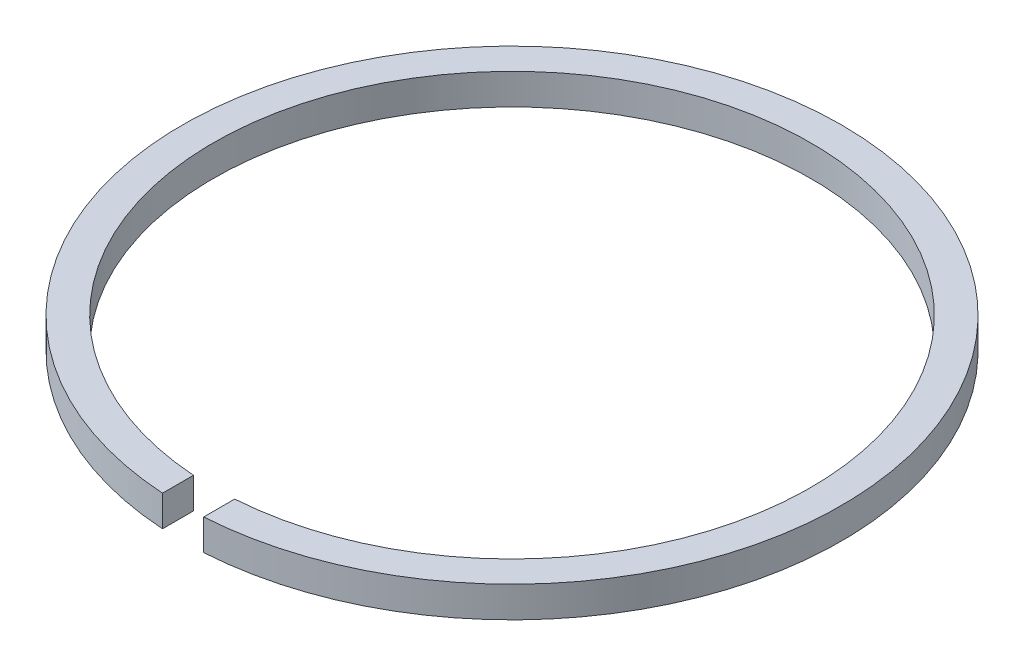
ISO-10303-21;
HEADER;
FILE_DESCRIPTION(('STEP AP214'),'2;1');
FILE_NAME('part.step','',(''),(''),'','','');
FILE_SCHEMA(('AUTOMOTIVE_DESIGN { 1 0 10303 214 1 1 1 1 }'));
ENDSEC;
DATA;
#1=APPLICATION_CONTEXT('core data for automotive mechanical design processes');
#2=APPLICATION_PROTOCOL_DEFINITION('international standard','automotive_design',2000,#1);
#3=PRODUCT_CONTEXT('',#1,'mechanical');
#4=PRODUCT('Part','Part','',(#3));
#5=PRODUCT_RELATED_PRODUCT_CATEGORY('part','',(#4));
#6=PRODUCT_DEFINITION_FORMATION('','',#4);
#7=PRODUCT_DEFINITION_CONTEXT('part definition',#1,'design');
#8=PRODUCT_DEFINITION('design','',#6,#7);
#9=PRODUCT_DEFINITION_SHAPE('','',#8);
#10=(LENGTH_UNIT() NAMED_UNIT(*) SI_UNIT(.MILLI.,.METRE.));
#11=(NAMED_UNIT(*) PLANE_ANGLE_UNIT() SI_UNIT($,.RADIAN.));
#12=(NAMED_UNIT(*) SI_UNIT($,.STERADIAN.) SOLID_ANGLE_UNIT());
#13=UNCERTAINTY_MEASURE_WITH_UNIT(LENGTH_MEASURE(1.E-05),#10,'distance_accuracy_value','');
#14=(GEOMETRIC_REPRESENTATION_CONTEXT(3) GLOBAL_UNCERTAINTY_ASSIGNED_CONTEXT((#13)) GLOBAL_UNIT_ASSIGNED_CONTEXT((#10,
#11,#12)) REPRESENTATION_CONTEXT('',''));
#15=CARTESIAN_POINT('',(0.,0.,0.));
#16=DIRECTION('',(0.,0.,1.));
#17=DIRECTION('',(1.,0.,0.));
#18=AXIS2_PLACEMENT_3D('',#15,#16,#17);
#19=CARTESIAN_POINT('',(0.,0.75,0.));
#20=DIRECTION('',(0.,-1.,0.));
#21=DIRECTION('',(0.,0.,-1.));
#22=AXIS2_PLACEMENT_3D('',#19,#20,#21);
#23=CYLINDRICAL_SURFACE('',#22,14.5);
#24=CARTESIAN_POINT('',(0.,-0.75,0.));
#25=DIRECTION('',(0.,1.,0.));
#26=DIRECTION('',(0.,0.,1.));
#27=AXIS2_PLACEMENT_3D('',#24,#25,#26);
#28=CIRCLE('',#27,14.5);
#29=CARTESIAN_POINT('',(1.,-0.75,14.4654761414894));
#30=VERTEX_POINT('',#29);
#31=CARTESIAN_POINT('',(-0.999999999999998,-0.75,14.4654761414894));
#32=VERTEX_POINT('',#31);
#33=EDGE_CURVE('E100',#30,#32,#28,.T.);
#34=ORIENTED_EDGE('',*,*,#33,.F.);
#35=DIRECTION('',(0.,-1.,0.));
#36=VECTOR('',#35,1.);
#37=CARTESIAN_POINT('',(1.,0.75,14.4654761414894));
#38=LINE('',#37,#36);
#39=CARTESIAN_POINT('',(1.,0.75,14.4654761414894));
#40=VERTEX_POINT('',#39);
#41=EDGE_CURVE('E11',#40,#30,#38,.T.);
#42=ORIENTED_EDGE('',*,*,#41,.F.);
#43=CARTESIAN_POINT('',(0.,0.75,0.));
#44=DIRECTION('',(0.,1.,0.));
#45=DIRECTION('',(0.,0.,1.));
#46=AXIS2_PLACEMENT_3D('',#43,#44,#45);
#47=CIRCLE('',#46,14.5);
#48=CARTESIAN_POINT('',(-0.999999999999998,0.75,14.4654761414894));
#49=VERTEX_POINT('',#48);
#50=EDGE_CURVE('E85',#40,#49,#47,.T.);
#51=ORIENTED_EDGE('',*,*,#50,.T.);
#52=DIRECTION('',(0.,-1.,0.));
#53=VECTOR('',#52,1.);
#54=CARTESIAN_POINT('',(-0.999999999999998,0.75,14.4654761414894));
#55=LINE('',#54,#53);
#56=EDGE_CURVE('E53',#49,#32,#55,.T.);
#57=ORIENTED_EDGE('',*,*,#56,.T.);
#58=EDGE_LOOP('',(#34,#42,#51,#57));
#59=FACE_BOUND('',#58,.T.);
#60=ADVANCED_FACE('F37',(#59),#23,.F.);
#61=CARTESIAN_POINT('',(1.,0.75,0.));
#62=DIRECTION('',(1.,0.,0.));
#63=DIRECTION('',(0.,0.,-1.));
#64=AXIS2_PLACEMENT_3D('',#61,#62,#63);
#65=PLANE('',#64);
#66=DIRECTION('',(0.,0.,1.));
#67=VECTOR('',#66,1.);
#68=CARTESIAN_POINT('',(1.,-0.75,0.));
#69=LINE('',#68,#67);
#70=CARTESIAN_POINT('',(1.,-0.75,15.9687194226713));
#71=VERTEX_POINT('',#70);
#72=EDGE_CURVE('E91',#30,#71,#69,.T.);
#73=ORIENTED_EDGE('',*,*,#72,.T.);
#74=DIRECTION('',(0.,-1.,0.));
#75=VECTOR('',#74,1.);
#76=CARTESIAN_POINT('',(1.,0.75,15.9687194226713));
#77=LINE('',#76,#75);
#78=CARTESIAN_POINT('',(1.,0.75,15.9687194226713));
#79=VERTEX_POINT('',#78);
#80=EDGE_CURVE('E45',#79,#71,#77,.T.);
#81=ORIENTED_EDGE('',*,*,#80,.F.);
#82=DIRECTION('',(0.,0.,1.));
#83=VECTOR('',#82,1.);
#84=CARTESIAN_POINT('',(1.,0.75,0.));
#85=LINE('',#84,#83);
#86=EDGE_CURVE('E79',#40,#79,#85,.T.);
#87=ORIENTED_EDGE('',*,*,#86,.F.);
#88=ORIENTED_EDGE('',*,*,#41,.T.);
#89=EDGE_LOOP('',(#73,#81,#87,#88));
#90=FACE_BOUND('',#89,.T.);
#91=ADVANCED_FACE('F89',(#90),#65,.F.);
#92=CARTESIAN_POINT('',(0.,0.75,0.));
#93=DIRECTION('',(0.,-1.,0.));
#94=DIRECTION('',(0.,0.,-1.));
#95=AXIS2_PLACEMENT_3D('',#92,#93,#94);
#96=CYLINDRICAL_SURFACE('',#95,16.);
#97=CARTESIAN_POINT('',(0.,-0.75,0.));
#98=DIRECTION('',(0.,1.,0.));
#99=DIRECTION('',(0.,0.,1.));
#100=AXIS2_PLACEMENT_3D('',#97,#98,#99);
#101=CIRCLE('',#100,16.);
#102=CARTESIAN_POINT('',(-0.999999999999998,-0.75,15.9687194226713));
#103=VERTEX_POINT('',#102);
#104=EDGE_CURVE('E103',#71,#103,#101,.T.);
#105=ORIENTED_EDGE('',*,*,#104,.T.);
#106=DIRECTION('',(0.,-1.,0.));
#107=VECTOR('',#106,1.);
#108=CARTESIAN_POINT('',(-0.999999999999998,0.75,15.9687194226713));
#109=LINE('',#108,#107);
#110=CARTESIAN_POINT('',(-0.999999999999998,0.75,15.9687194226713));
#111=VERTEX_POINT('',#110);
#112=EDGE_CURVE('E67',#111,#103,#109,.T.);
#113=ORIENTED_EDGE('',*,*,#112,.F.);
#114=CARTESIAN_POINT('',(0.,0.75,0.));
#115=DIRECTION('',(0.,1.,0.));
#116=DIRECTION('',(0.,0.,1.));
#117=AXIS2_PLACEMENT_3D('',#114,#115,#116);
#118=CIRCLE('',#117,16.);
#119=EDGE_CURVE('E84',#79,#111,#118,.T.);
#120=ORIENTED_EDGE('',*,*,#119,.F.);
#121=ORIENTED_EDGE('',*,*,#80,.T.);
#122=EDGE_LOOP('',(#105,#113,#120,#121));
#123=FACE_BOUND('',#122,.T.);
#124=ADVANCED_FACE('F94',(#123),#96,.T.);
#125=CARTESIAN_POINT('',(-1.,0.75,0.));
#126=DIRECTION('',(1.,0.,0.));
#127=DIRECTION('',(0.,0.,-1.));
#128=AXIS2_PLACEMENT_3D('',#125,#126,#127);
#129=PLANE('',#128);
#130=DIRECTION('',(0.,0.,1.));
#131=VECTOR('',#130,1.);
#132=CARTESIAN_POINT('',(-1.,-0.75,0.));
#133=LINE('',#132,#131);
#134=EDGE_CURVE('E105',#32,#103,#133,.T.);
#135=ORIENTED_EDGE('',*,*,#134,.F.);
#136=ORIENTED_EDGE('',*,*,#56,.F.);
#137=DIRECTION('',(0.,0.,1.));
#138=VECTOR('',#137,1.);
#139=CARTESIAN_POINT('',(-1.,0.75,0.));
#140=LINE('',#139,#138);
#141=EDGE_CURVE('E95',#49,#111,#140,.T.);
#142=ORIENTED_EDGE('',*,*,#141,.T.);
#143=ORIENTED_EDGE('',*,*,#112,.T.);
#144=EDGE_LOOP('',(#135,#136,#142,#143));
#145=FACE_BOUND('',#144,.T.);
#146=ADVANCED_FACE('F110',(#145),#129,.T.);
#147=CARTESIAN_POINT('',(0.,0.75,0.));
#148=DIRECTION('',(0.,1.,0.));
#149=DIRECTION('',(0.,0.,1.));
#150=AXIS2_PLACEMENT_3D('',#147,#148,#149);
#151=PLANE('',#150);
#152=ORIENTED_EDGE('',*,*,#50,.F.);
#153=ORIENTED_EDGE('',*,*,#86,.T.);
#154=ORIENTED_EDGE('',*,*,#119,.T.);
#155=ORIENTED_EDGE('',*,*,#141,.F.);
#156=EDGE_LOOP('',(#152,#153,#154,#155));
#157=FACE_BOUND('',#156,.T.);
#158=ADVANCED_FACE('F81',(#157),#151,.T.);
#159=CARTESIAN_POINT('',(0.,-0.75,0.));
#160=DIRECTION('',(0.,1.,0.));
#161=DIRECTION('',(0.,0.,1.));
#162=AXIS2_PLACEMENT_3D('',#159,#160,#161);
#163=PLANE('',#162);
#164=ORIENTED_EDGE('',*,*,#33,.T.);
#165=ORIENTED_EDGE('',*,*,#134,.T.);
#166=ORIENTED_EDGE('',*,*,#104,.F.);
#167=ORIENTED_EDGE('',*,*,#72,.F.);
#168=EDGE_LOOP('',(#164,#165,#166,#167));
#169=FACE_BOUND('',#168,.T.);
#170=ADVANCED_FACE('F117',(#169),#163,.F.);
#171=CLOSED_SHELL('',(#60,#91,#124,#146,#158,#170));
#172=MANIFOLD_SOLID_BREP('B2',#171);
#173=ADVANCED_BREP_SHAPE_REPRESENTATION('',(#18,#172),#14);
#174=SHAPE_DEFINITION_REPRESENTATION(#9,#173);
ENDSEC;
END-ISO-10303-21;
